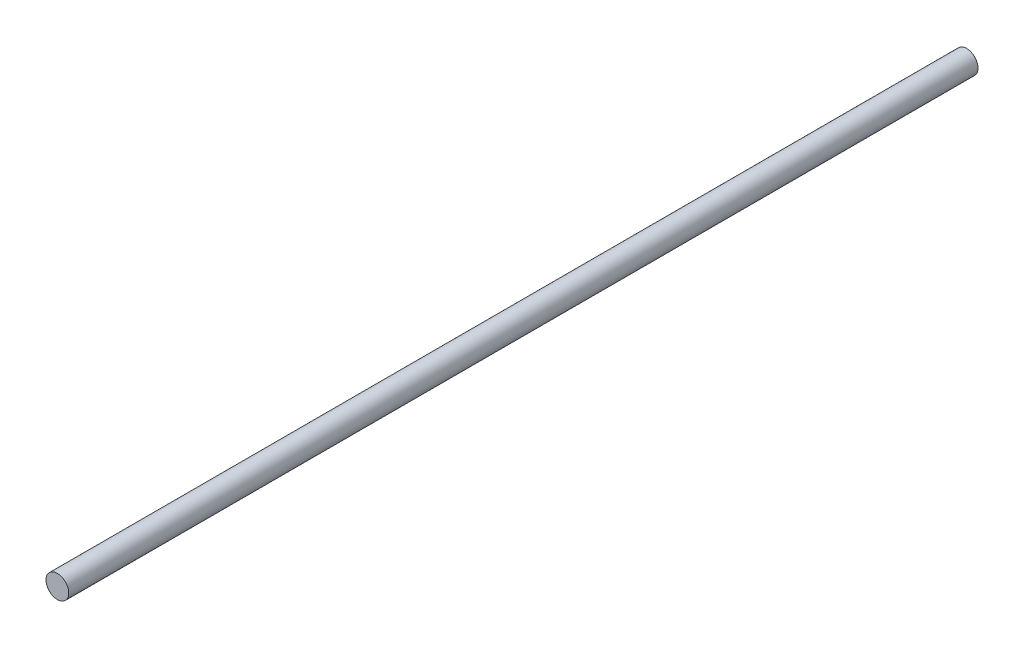
ISO-10303-21;
HEADER;
FILE_DESCRIPTION(('STEP AP214'),'2;1');
FILE_NAME('part.step','',(''),(''),'','','');
FILE_SCHEMA(('AUTOMOTIVE_DESIGN { 1 0 10303 214 1 1 1 1 }'));
ENDSEC;
DATA;
#1=APPLICATION_CONTEXT('core data for automotive mechanical design processes');
#2=APPLICATION_PROTOCOL_DEFINITION('international standard','automotive_design',2000,#1);
#3=PRODUCT_CONTEXT('',#1,'mechanical');
#4=PRODUCT('Part','Part','',(#3));
#5=PRODUCT_RELATED_PRODUCT_CATEGORY('part','',(#4));
#6=PRODUCT_DEFINITION_FORMATION('','',#4);
#7=PRODUCT_DEFINITION_CONTEXT('part definition',#1,'design');
#8=PRODUCT_DEFINITION('design','',#6,#7);
#9=PRODUCT_DEFINITION_SHAPE('','',#8);
#10=(LENGTH_UNIT() NAMED_UNIT(*) SI_UNIT(.MILLI.,.METRE.));
#11=(NAMED_UNIT(*) PLANE_ANGLE_UNIT() SI_UNIT($,.RADIAN.));
#12=(NAMED_UNIT(*) SI_UNIT($,.STERADIAN.) SOLID_ANGLE_UNIT());
#13=UNCERTAINTY_MEASURE_WITH_UNIT(LENGTH_MEASURE(1.E-05),#10,'distance_accuracy_value','');
#14=(GEOMETRIC_REPRESENTATION_CONTEXT(3) GLOBAL_UNCERTAINTY_ASSIGNED_CONTEXT((#13)) GLOBAL_UNIT_ASSIGNED_CONTEXT((#10,
#11,#12)) REPRESENTATION_CONTEXT('',''));
#15=CARTESIAN_POINT('',(0.,0.,0.));
#16=DIRECTION('',(0.,0.,1.));
#17=DIRECTION('',(1.,0.,0.));
#18=AXIS2_PLACEMENT_3D('',#15,#16,#17);
#19=CARTESIAN_POINT('',(0.,0.,304.8));
#20=DIRECTION('',(0.,0.,-1.));
#21=DIRECTION('',(-1.,0.,0.));
#22=AXIS2_PLACEMENT_3D('',#19,#20,#21);
#23=CYLINDRICAL_SURFACE('',#22,3.81);
#24=CARTESIAN_POINT('',(0.,0.,304.8));
#25=DIRECTION('',(0.,0.,1.));
#26=DIRECTION('',(1.,0.,0.));
#27=AXIS2_PLACEMENT_3D('',#24,#25,#26);
#28=CIRCLE('',#27,3.81);
#29=CARTESIAN_POINT('',(-3.81,0.,304.8));
#30=VERTEX_POINT('',#29);
#31=EDGE_CURVE('E10',#30,#30,#28,.T.);
#32=CARTESIAN_POINT('',(0.,0.,0.));
#33=DIRECTION('',(0.,0.,1.));
#34=DIRECTION('',(1.,0.,0.));
#35=AXIS2_PLACEMENT_3D('',#32,#33,#34);
#36=CIRCLE('',#35,3.81);
#37=CARTESIAN_POINT('',(-3.81,0.,0.));
#38=VERTEX_POINT('',#37);
#39=EDGE_CURVE('E35',#38,#38,#36,.T.);
#40=CARTESIAN_POINT('',(-3.81,0.,304.8));
#41=CARTESIAN_POINT('',(-3.81,0.,301.625));
#42=CARTESIAN_POINT('',(-3.81,0.,298.45));
#43=CARTESIAN_POINT('',(-3.81,0.,292.1));
#44=CARTESIAN_POINT('',(-3.81,0.,288.925));
#45=CARTESIAN_POINT('',(-3.81,0.,282.575));
#46=CARTESIAN_POINT('',(-3.81,0.,279.4));
#47=CARTESIAN_POINT('',(-3.81,0.,273.05));
#48=CARTESIAN_POINT('',(-3.81,0.,269.875));
#49=CARTESIAN_POINT('',(-3.81,0.,263.525));
#50=CARTESIAN_POINT('',(-3.81,0.,260.35));
#51=CARTESIAN_POINT('',(-3.81,0.,254.));
#52=CARTESIAN_POINT('',(-3.81,0.,250.825));
#53=CARTESIAN_POINT('',(-3.81,0.,244.475));
#54=CARTESIAN_POINT('',(-3.81,0.,241.3));
#55=CARTESIAN_POINT('',(-3.81,0.,234.95));
#56=CARTESIAN_POINT('',(-3.81,0.,231.775));
#57=CARTESIAN_POINT('',(-3.81,0.,225.425));
#58=CARTESIAN_POINT('',(-3.81,0.,222.25));
#59=CARTESIAN_POINT('',(-3.81,0.,215.9));
#60=CARTESIAN_POINT('',(-3.81,0.,212.725));
#61=CARTESIAN_POINT('',(-3.81,0.,206.375));
#62=CARTESIAN_POINT('',(-3.81,0.,203.2));
#63=CARTESIAN_POINT('',(-3.81,0.,196.85));
#64=CARTESIAN_POINT('',(-3.81,0.,193.675));
#65=CARTESIAN_POINT('',(-3.81,0.,187.325));
#66=CARTESIAN_POINT('',(-3.81,0.,184.15));
#67=CARTESIAN_POINT('',(-3.81,0.,177.8));
#68=CARTESIAN_POINT('',(-3.81,0.,174.625));
#69=CARTESIAN_POINT('',(-3.81,0.,168.275));
#70=CARTESIAN_POINT('',(-3.81,0.,165.1));
#71=CARTESIAN_POINT('',(-3.81,0.,158.75));
#72=CARTESIAN_POINT('',(-3.81,0.,155.575));
#73=CARTESIAN_POINT('',(-3.81,0.,149.225));
#74=CARTESIAN_POINT('',(-3.81,0.,146.05));
#75=CARTESIAN_POINT('',(-3.81,0.,139.7));
#76=CARTESIAN_POINT('',(-3.81,0.,136.525));
#77=CARTESIAN_POINT('',(-3.81,0.,130.175));
#78=CARTESIAN_POINT('',(-3.81,0.,127.));
#79=CARTESIAN_POINT('',(-3.81,0.,120.65));
#80=CARTESIAN_POINT('',(-3.81,0.,117.475));
#81=CARTESIAN_POINT('',(-3.81,0.,111.125));
#82=CARTESIAN_POINT('',(-3.81,0.,107.95));
#83=CARTESIAN_POINT('',(-3.81,0.,101.6));
#84=CARTESIAN_POINT('',(-3.81,0.,98.425));
#85=CARTESIAN_POINT('',(-3.81,0.,92.075));
#86=CARTESIAN_POINT('',(-3.81,0.,88.9));
#87=CARTESIAN_POINT('',(-3.81,0.,82.55));
#88=CARTESIAN_POINT('',(-3.81,0.,79.375));
#89=CARTESIAN_POINT('',(-3.81,0.,73.025));
#90=CARTESIAN_POINT('',(-3.81,0.,69.85));
#91=CARTESIAN_POINT('',(-3.81,0.,63.5));
#92=CARTESIAN_POINT('',(-3.81,0.,60.325));
#93=CARTESIAN_POINT('',(-3.81,0.,53.975));
#94=CARTESIAN_POINT('',(-3.81,0.,50.8));
#95=CARTESIAN_POINT('',(-3.81,0.,44.45));
#96=CARTESIAN_POINT('',(-3.81,0.,41.275));
#97=CARTESIAN_POINT('',(-3.81,0.,34.925));
#98=CARTESIAN_POINT('',(-3.81,0.,31.75));
#99=CARTESIAN_POINT('',(-3.81,0.,25.4));
#100=CARTESIAN_POINT('',(-3.81,0.,22.225));
#101=CARTESIAN_POINT('',(-3.81,0.,15.875));
#102=CARTESIAN_POINT('',(-3.81,0.,12.7));
#103=CARTESIAN_POINT('',(-3.81,0.,6.35));
#104=CARTESIAN_POINT('',(-3.81,0.,3.175));
#105=CARTESIAN_POINT('',(-3.81,0.,0.));
#106=B_SPLINE_CURVE_WITH_KNOTS('',3,(#40,#41,#42,#43,#44,#45,#46,#47,#48,#49,#50,#51,#52,#53,
#54,#55,#56,#57,#58,#59,#60,#61,#62,#63,#64,#65,#66,#67,#68,#69,#70,#71,#72,#73,#74,#75,#76,#77,
#78,#79,#80,#81,#82,#83,#84,#85,#86,#87,#88,#89,#90,#91,#92,#93,#94,#95,#96,#97,#98,#99,#100,
#101,#102,#103,#104,#105),.UNSPECIFIED.,.F.,.F.,(4,2,2,2,2,2,2,2,2,2,2,2,2,2,2,2,2,2,2,2,2,2,2,
2,2,2,2,2,2,2,2,2,4),(0.,9.52500000000001,19.05,28.575,38.1,47.625,57.15,66.675,76.2,
85.7250000000001,95.2500000000001,104.775,114.3,123.825,133.35,142.875,152.4,161.925,171.45,
180.975,190.5,200.025,209.55,219.075,228.6,238.125,247.65,257.175,266.7,276.225,285.75,295.275,
304.8),.UNSPECIFIED.);
#107=EDGE_CURVE('BSEAM32',#30,#38,#106,.T.);
#108=ORIENTED_EDGE('',*,*,#31,.F.);
#109=ORIENTED_EDGE('',*,*,#39,.T.);
#110=ORIENTED_EDGE('',*,*,#107,.T.);
#111=ORIENTED_EDGE('',*,*,#107,.F.);
#112=EDGE_LOOP('',(#108,#110,#109,#111));
#113=FACE_BOUND('',#112,.T.);
#114=ADVANCED_FACE('F32',(#113),#23,.T.);
#115=CARTESIAN_POINT('',(0.,0.,304.8));
#116=DIRECTION('',(0.,0.,1.));
#117=DIRECTION('',(1.,0.,0.));
#118=AXIS2_PLACEMENT_3D('',#115,#116,#117);
#119=PLANE('',#118);
#120=ORIENTED_EDGE('',*,*,#31,.T.);
#121=EDGE_LOOP('',(#120));
#122=FACE_BOUND('',#121,.T.);
#123=ADVANCED_FACE('F47',(#122),#119,.T.);
#124=CARTESIAN_POINT('',(0.,0.,0.));
#125=DIRECTION('',(0.,0.,1.));
#126=DIRECTION('',(1.,0.,0.));
#127=AXIS2_PLACEMENT_3D('',#124,#125,#126);
#128=PLANE('',#127);
#129=ORIENTED_EDGE('',*,*,#39,.F.);
#130=EDGE_LOOP('',(#129));
#131=FACE_BOUND('',#130,.T.);
#132=ADVANCED_FACE('F45',(#131),#128,.F.);
#133=CLOSED_SHELL('',(#114,#123,#132));
#134=MANIFOLD_SOLID_BREP('B2',#133);
#135=ADVANCED_BREP_SHAPE_REPRESENTATION('',(#18,#134),#14);
#136=SHAPE_DEFINITION_REPRESENTATION(#9,#135);
ENDSEC;
END-ISO-10303-21;
